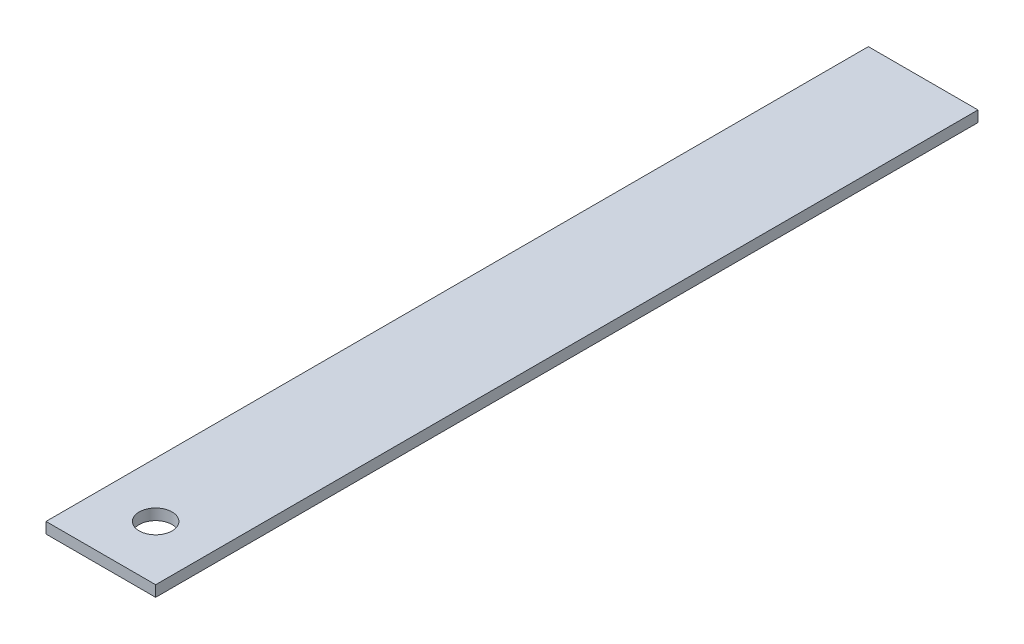
ISO-10303-21;
HEADER;
FILE_DESCRIPTION(('STEP AP214'),'2;1');
FILE_NAME('part.step','',(''),(''),'','','');
FILE_SCHEMA(('AUTOMOTIVE_DESIGN { 1 0 10303 214 1 1 1 1 }'));
ENDSEC;
DATA;
#1=APPLICATION_CONTEXT('core data for automotive mechanical design processes');
#2=APPLICATION_PROTOCOL_DEFINITION('international standard','automotive_design',2000,#1);
#3=PRODUCT_CONTEXT('',#1,'mechanical');
#4=PRODUCT('Part','Part','',(#3));
#5=PRODUCT_RELATED_PRODUCT_CATEGORY('part','',(#4));
#6=PRODUCT_DEFINITION_FORMATION('','',#4);
#7=PRODUCT_DEFINITION_CONTEXT('part definition',#1,'design');
#8=PRODUCT_DEFINITION('design','',#6,#7);
#9=PRODUCT_DEFINITION_SHAPE('','',#8);
#10=(LENGTH_UNIT() NAMED_UNIT(*) SI_UNIT(.MILLI.,.METRE.));
#11=(NAMED_UNIT(*) PLANE_ANGLE_UNIT() SI_UNIT($,.RADIAN.));
#12=(NAMED_UNIT(*) SI_UNIT($,.STERADIAN.) SOLID_ANGLE_UNIT());
#13=UNCERTAINTY_MEASURE_WITH_UNIT(LENGTH_MEASURE(1.E-05),#10,'distance_accuracy_value','');
#14=(GEOMETRIC_REPRESENTATION_CONTEXT(3) GLOBAL_UNCERTAINTY_ASSIGNED_CONTEXT((#13)) GLOBAL_UNIT_ASSIGNED_CONTEXT((#10,
#11,#12)) REPRESENTATION_CONTEXT('',''));
#15=CARTESIAN_POINT('',(0.,0.,0.));
#16=DIRECTION('',(0.,0.,1.));
#17=DIRECTION('',(1.,0.,0.));
#18=AXIS2_PLACEMENT_3D('',#15,#16,#17);
#19=CARTESIAN_POINT('',(0.,2.,0.));
#20=DIRECTION('',(0.,-1.,0.));
#21=DIRECTION('',(0.,0.,-1.));
#22=AXIS2_PLACEMENT_3D('',#19,#20,#21);
#23=PLANE('',#22);
#24=DIRECTION('',(0.,0.,-1.));
#25=VECTOR('',#24,1.);
#26=CARTESIAN_POINT('',(9.99999999999994,2.,75.));
#27=LINE('',#26,#25);
#28=CARTESIAN_POINT('',(9.99999999999994,2.,75.));
#29=VERTEX_POINT('',#28);
#30=CARTESIAN_POINT('',(9.99999999999997,2.,-75.0000000000001));
#31=VERTEX_POINT('',#30);
#32=EDGE_CURVE('E91',#29,#31,#27,.T.);
#33=ORIENTED_EDGE('',*,*,#32,.T.);
#34=DIRECTION('',(-1.,0.,0.));
#35=VECTOR('',#34,1.);
#36=CARTESIAN_POINT('',(-9.99999999999997,2.,-75.0000000000001));
#37=LINE('',#36,#35);
#38=CARTESIAN_POINT('',(-9.99999999999997,2.,-75.0000000000001));
#39=VERTEX_POINT('',#38);
#40=EDGE_CURVE('E86',#31,#39,#37,.T.);
#41=ORIENTED_EDGE('',*,*,#40,.T.);
#42=DIRECTION('',(0.,0.,1.));
#43=VECTOR('',#42,1.);
#44=CARTESIAN_POINT('',(-10.0000000000001,2.,74.9999999999999));
#45=LINE('',#44,#43);
#46=CARTESIAN_POINT('',(-10.0000000000001,2.,74.9999999999999));
#47=VERTEX_POINT('',#46);
#48=EDGE_CURVE('E89',#39,#47,#45,.T.);
#49=ORIENTED_EDGE('',*,*,#48,.T.);
#50=DIRECTION('',(1.,0.,0.));
#51=VECTOR('',#50,1.);
#52=CARTESIAN_POINT('',(-10.0000000000001,2.,74.9999999999999));
#53=LINE('',#52,#51);
#54=EDGE_CURVE('E56',#47,#29,#53,.T.);
#55=ORIENTED_EDGE('',*,*,#54,.T.);
#56=EDGE_LOOP('',(#33,#41,#49,#55));
#57=FACE_BOUND('',#56,.T.);
#58=CARTESIAN_POINT('',(0.,2.,64.9999999999999));
#59=DIRECTION('',(0.,1.,0.));
#60=DIRECTION('',(0.,0.,1.));
#61=AXIS2_PLACEMENT_3D('',#58,#59,#60);
#62=CIRCLE('',#61,3.);
#63=CARTESIAN_POINT('',(0.,2.,67.9999999999999));
#64=VERTEX_POINT('',#63);
#65=EDGE_CURVE('E106',#64,#64,#62,.T.);
#66=ORIENTED_EDGE('',*,*,#65,.F.);
#67=EDGE_LOOP('',(#66));
#68=FACE_BOUND('',#67,.T.);
#69=ADVANCED_FACE('F39',(#57,#68),#23,.F.);
#70=CARTESIAN_POINT('',(0.,0.,0.));
#71=DIRECTION('',(0.,-1.,0.));
#72=DIRECTION('',(0.,0.,-1.));
#73=AXIS2_PLACEMENT_3D('',#70,#71,#72);
#74=PLANE('',#73);
#75=DIRECTION('',(0.,0.,-1.));
#76=VECTOR('',#75,1.);
#77=CARTESIAN_POINT('',(9.99999999999994,0.,75.));
#78=LINE('',#77,#76);
#79=CARTESIAN_POINT('',(9.99999999999994,0.,75.));
#80=VERTEX_POINT('',#79);
#81=CARTESIAN_POINT('',(9.99999999999997,0.,-75.0000000000001));
#82=VERTEX_POINT('',#81);
#83=EDGE_CURVE('E103',#80,#82,#78,.T.);
#84=ORIENTED_EDGE('',*,*,#83,.F.);
#85=DIRECTION('',(1.,0.,0.));
#86=VECTOR('',#85,1.);
#87=CARTESIAN_POINT('',(-10.0000000000001,0.,74.9999999999999));
#88=LINE('',#87,#86);
#89=CARTESIAN_POINT('',(-10.0000000000001,0.,74.9999999999999));
#90=VERTEX_POINT('',#89);
#91=EDGE_CURVE('E79',#90,#80,#88,.T.);
#92=ORIENTED_EDGE('',*,*,#91,.F.);
#93=DIRECTION('',(0.,0.,1.));
#94=VECTOR('',#93,1.);
#95=CARTESIAN_POINT('',(-10.0000000000001,0.,74.9999999999999));
#96=LINE('',#95,#94);
#97=CARTESIAN_POINT('',(-9.99999999999997,0.,-75.0000000000001));
#98=VERTEX_POINT('',#97);
#99=EDGE_CURVE('E73',#98,#90,#96,.T.);
#100=ORIENTED_EDGE('',*,*,#99,.F.);
#101=DIRECTION('',(-1.,0.,0.));
#102=VECTOR('',#101,1.);
#103=CARTESIAN_POINT('',(-9.99999999999997,0.,-75.0000000000001));
#104=LINE('',#103,#102);
#105=EDGE_CURVE('E95',#82,#98,#104,.T.);
#106=ORIENTED_EDGE('',*,*,#105,.F.);
#107=EDGE_LOOP('',(#84,#92,#100,#106));
#108=FACE_BOUND('',#107,.T.);
#109=CARTESIAN_POINT('',(0.,0.,64.9999999999999));
#110=DIRECTION('',(0.,1.,0.));
#111=DIRECTION('',(0.,0.,1.));
#112=AXIS2_PLACEMENT_3D('',#109,#110,#111);
#113=CIRCLE('',#112,3.);
#114=CARTESIAN_POINT('',(0.,0.,67.9999999999999));
#115=VERTEX_POINT('',#114);
#116=EDGE_CURVE('E118',#115,#115,#113,.T.);
#117=ORIENTED_EDGE('',*,*,#116,.T.);
#118=EDGE_LOOP('',(#117));
#119=FACE_BOUND('',#118,.T.);
#120=ADVANCED_FACE('F114',(#108,#119),#74,.T.);
#121=CARTESIAN_POINT('',(9.99999999999994,2.,75.));
#122=DIRECTION('',(-1.,0.,0.));
#123=DIRECTION('',(0.,0.,1.));
#124=AXIS2_PLACEMENT_3D('',#121,#122,#123);
#125=PLANE('',#124);
#126=ORIENTED_EDGE('',*,*,#83,.T.);
#127=DIRECTION('',(0.,-1.,0.));
#128=VECTOR('',#127,1.);
#129=CARTESIAN_POINT('',(9.99999999999997,2.,-75.0000000000001));
#130=LINE('',#129,#128);
#131=EDGE_CURVE('E11',#31,#82,#130,.T.);
#132=ORIENTED_EDGE('',*,*,#131,.F.);
#133=ORIENTED_EDGE('',*,*,#32,.F.);
#134=DIRECTION('',(0.,-1.,0.));
#135=VECTOR('',#134,1.);
#136=CARTESIAN_POINT('',(9.99999999999994,2.,75.));
#137=LINE('',#136,#135);
#138=EDGE_CURVE('E99',#29,#80,#137,.T.);
#139=ORIENTED_EDGE('',*,*,#138,.T.);
#140=EDGE_LOOP('',(#126,#132,#133,#139));
#141=FACE_BOUND('',#140,.T.);
#142=ADVANCED_FACE('F41',(#141),#125,.F.);
#143=CARTESIAN_POINT('',(-9.99999999999997,2.,-75.0000000000001));
#144=DIRECTION('',(0.,0.,1.));
#145=DIRECTION('',(1.,0.,0.));
#146=AXIS2_PLACEMENT_3D('',#143,#144,#145);
#147=PLANE('',#146);
#148=ORIENTED_EDGE('',*,*,#105,.T.);
#149=DIRECTION('',(0.,-1.,0.));
#150=VECTOR('',#149,1.);
#151=CARTESIAN_POINT('',(-9.99999999999997,2.,-75.0000000000001));
#152=LINE('',#151,#150);
#153=EDGE_CURVE('E48',#39,#98,#152,.T.);
#154=ORIENTED_EDGE('',*,*,#153,.F.);
#155=ORIENTED_EDGE('',*,*,#40,.F.);
#156=ORIENTED_EDGE('',*,*,#131,.T.);
#157=EDGE_LOOP('',(#148,#154,#155,#156));
#158=FACE_BOUND('',#157,.T.);
#159=ADVANCED_FACE('F94',(#158),#147,.F.);
#160=CARTESIAN_POINT('',(-10.0000000000001,2.,74.9999999999999));
#161=DIRECTION('',(1.,0.,0.));
#162=DIRECTION('',(0.,0.,-1.));
#163=AXIS2_PLACEMENT_3D('',#160,#161,#162);
#164=PLANE('',#163);
#165=ORIENTED_EDGE('',*,*,#99,.T.);
#166=DIRECTION('',(0.,-1.,0.));
#167=VECTOR('',#166,1.);
#168=CARTESIAN_POINT('',(-10.0000000000001,2.,74.9999999999999));
#169=LINE('',#168,#167);
#170=EDGE_CURVE('E96',#47,#90,#169,.T.);
#171=ORIENTED_EDGE('',*,*,#170,.F.);
#172=ORIENTED_EDGE('',*,*,#48,.F.);
#173=ORIENTED_EDGE('',*,*,#153,.T.);
#174=EDGE_LOOP('',(#165,#171,#172,#173));
#175=FACE_BOUND('',#174,.T.);
#176=ADVANCED_FACE('F97',(#175),#164,.F.);
#177=CARTESIAN_POINT('',(-10.0000000000001,2.,74.9999999999999));
#178=DIRECTION('',(0.,0.,-1.));
#179=DIRECTION('',(-1.,0.,0.));
#180=AXIS2_PLACEMENT_3D('',#177,#178,#179);
#181=PLANE('',#180);
#182=ORIENTED_EDGE('',*,*,#91,.T.);
#183=ORIENTED_EDGE('',*,*,#138,.F.);
#184=ORIENTED_EDGE('',*,*,#54,.F.);
#185=ORIENTED_EDGE('',*,*,#170,.T.);
#186=EDGE_LOOP('',(#182,#183,#184,#185));
#187=FACE_BOUND('',#186,.T.);
#188=ADVANCED_FACE('F111',(#187),#181,.F.);
#189=CARTESIAN_POINT('',(0.,2.,64.9999999999999));
#190=DIRECTION('',(0.,-1.,0.));
#191=DIRECTION('',(0.,0.,-1.));
#192=AXIS2_PLACEMENT_3D('',#189,#190,#191);
#193=CYLINDRICAL_SURFACE('',#192,3.);
#194=ORIENTED_EDGE('',*,*,#65,.T.);
#195=EDGE_LOOP('',(#194));
#196=FACE_BOUND('',#195,.T.);
#197=ORIENTED_EDGE('',*,*,#116,.F.);
#198=EDGE_LOOP('',(#197));
#199=FACE_BOUND('',#198,.T.);
#200=ADVANCED_FACE('F124',(#196,#199),#193,.F.);
#201=CLOSED_SHELL('',(#69,#120,#142,#159,#176,#188,#200));
#202=MANIFOLD_SOLID_BREP('B2',#201);
#203=ADVANCED_BREP_SHAPE_REPRESENTATION('',(#18,#202),#14);
#204=SHAPE_DEFINITION_REPRESENTATION(#9,#203);
ENDSEC;
END-ISO-10303-21;
